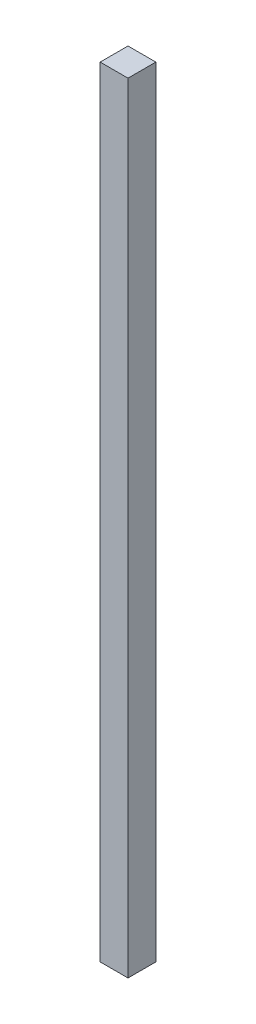
ISO-10303-21;
HEADER;
FILE_DESCRIPTION(('STEP AP214'),'2;1');
FILE_NAME('part.step','',(''),(''),'','','');
FILE_SCHEMA(('AUTOMOTIVE_DESIGN { 1 0 10303 214 1 1 1 1 }'));
ENDSEC;
DATA;
#1=APPLICATION_CONTEXT('core data for automotive mechanical design processes');
#2=APPLICATION_PROTOCOL_DEFINITION('international standard','automotive_design',2000,#1);
#3=PRODUCT_CONTEXT('',#1,'mechanical');
#4=PRODUCT('Part','Part','',(#3));
#5=PRODUCT_RELATED_PRODUCT_CATEGORY('part','',(#4));
#6=PRODUCT_DEFINITION_FORMATION('','',#4);
#7=PRODUCT_DEFINITION_CONTEXT('part definition',#1,'design');
#8=PRODUCT_DEFINITION('design','',#6,#7);
#9=PRODUCT_DEFINITION_SHAPE('','',#8);
#10=(LENGTH_UNIT() NAMED_UNIT(*) SI_UNIT(.MILLI.,.METRE.));
#11=(NAMED_UNIT(*) PLANE_ANGLE_UNIT() SI_UNIT($,.RADIAN.));
#12=(NAMED_UNIT(*) SI_UNIT($,.STERADIAN.) SOLID_ANGLE_UNIT());
#13=UNCERTAINTY_MEASURE_WITH_UNIT(LENGTH_MEASURE(1.E-05),#10,'distance_accuracy_value','');
#14=(GEOMETRIC_REPRESENTATION_CONTEXT(3) GLOBAL_UNCERTAINTY_ASSIGNED_CONTEXT((#13)) GLOBAL_UNIT_ASSIGNED_CONTEXT((#10,
#11,#12)) REPRESENTATION_CONTEXT('',''));
#15=CARTESIAN_POINT('',(0.,0.,0.));
#16=DIRECTION('',(0.,0.,1.));
#17=DIRECTION('',(1.,0.,0.));
#18=AXIS2_PLACEMENT_3D('',#15,#16,#17);
#19=CARTESIAN_POINT('',(0.,700.,0.));
#20=DIRECTION('',(-1.,0.,0.));
#21=DIRECTION('',(0.,0.,1.));
#22=AXIS2_PLACEMENT_3D('',#19,#20,#21);
#23=PLANE('',#22);
#24=DIRECTION('',(0.,0.,-1.));
#25=VECTOR('',#24,1.);
#26=CARTESIAN_POINT('',(0.,0.,0.));
#27=LINE('',#26,#25);
#28=CARTESIAN_POINT('',(0.,0.,25.));
#29=VERTEX_POINT('',#28);
#30=CARTESIAN_POINT('',(0.,0.,0.));
#31=VERTEX_POINT('',#30);
#32=EDGE_CURVE('E96',#29,#31,#27,.T.);
#33=ORIENTED_EDGE('',*,*,#32,.T.);
#34=DIRECTION('',(0.,-1.,0.));
#35=VECTOR('',#34,1.);
#36=CARTESIAN_POINT('',(0.,700.,0.));
#37=LINE('',#36,#35);
#38=CARTESIAN_POINT('',(0.,700.,0.));
#39=VERTEX_POINT('',#38);
#40=EDGE_CURVE('E11',#39,#31,#37,.T.);
#41=ORIENTED_EDGE('',*,*,#40,.F.);
#42=DIRECTION('',(0.,0.,-1.));
#43=VECTOR('',#42,1.);
#44=CARTESIAN_POINT('',(0.,700.,0.));
#45=LINE('',#44,#43);
#46=CARTESIAN_POINT('',(0.,700.,25.));
#47=VERTEX_POINT('',#46);
#48=EDGE_CURVE('E84',#47,#39,#45,.T.);
#49=ORIENTED_EDGE('',*,*,#48,.F.);
#50=DIRECTION('',(0.,-1.,0.));
#51=VECTOR('',#50,1.);
#52=CARTESIAN_POINT('',(0.,700.,25.));
#53=LINE('',#52,#51);
#54=EDGE_CURVE('E92',#47,#29,#53,.T.);
#55=ORIENTED_EDGE('',*,*,#54,.T.);
#56=EDGE_LOOP('',(#33,#41,#49,#55));
#57=FACE_BOUND('',#56,.T.);
#58=ADVANCED_FACE('F33',(#57),#23,.F.);
#59=CARTESIAN_POINT('',(0.,700.,0.));
#60=DIRECTION('',(0.,0.,1.));
#61=DIRECTION('',(1.,0.,0.));
#62=AXIS2_PLACEMENT_3D('',#59,#60,#61);
#63=PLANE('',#62);
#64=DIRECTION('',(-1.,0.,0.));
#65=VECTOR('',#64,1.);
#66=CARTESIAN_POINT('',(0.,0.,0.));
#67=LINE('',#66,#65);
#68=CARTESIAN_POINT('',(-25.,0.,0.));
#69=VERTEX_POINT('',#68);
#70=EDGE_CURVE('E88',#31,#69,#67,.T.);
#71=ORIENTED_EDGE('',*,*,#70,.T.);
#72=DIRECTION('',(0.,-1.,0.));
#73=VECTOR('',#72,1.);
#74=CARTESIAN_POINT('',(-25.,700.,0.));
#75=LINE('',#74,#73);
#76=CARTESIAN_POINT('',(-25.,700.,0.));
#77=VERTEX_POINT('',#76);
#78=EDGE_CURVE('E41',#77,#69,#75,.T.);
#79=ORIENTED_EDGE('',*,*,#78,.F.);
#80=DIRECTION('',(-1.,0.,0.));
#81=VECTOR('',#80,1.);
#82=CARTESIAN_POINT('',(0.,700.,0.));
#83=LINE('',#82,#81);
#84=EDGE_CURVE('E79',#39,#77,#83,.T.);
#85=ORIENTED_EDGE('',*,*,#84,.F.);
#86=ORIENTED_EDGE('',*,*,#40,.T.);
#87=EDGE_LOOP('',(#71,#79,#85,#86));
#88=FACE_BOUND('',#87,.T.);
#89=ADVANCED_FACE('F87',(#88),#63,.F.);
#90=CARTESIAN_POINT('',(-25.,700.,0.));
#91=DIRECTION('',(1.,0.,0.));
#92=DIRECTION('',(0.,0.,-1.));
#93=AXIS2_PLACEMENT_3D('',#90,#91,#92);
#94=PLANE('',#93);
#95=DIRECTION('',(0.,0.,1.));
#96=VECTOR('',#95,1.);
#97=CARTESIAN_POINT('',(-25.,0.,0.));
#98=LINE('',#97,#96);
#99=CARTESIAN_POINT('',(-25.,0.,25.));
#100=VERTEX_POINT('',#99);
#101=EDGE_CURVE('E66',#69,#100,#98,.T.);
#102=ORIENTED_EDGE('',*,*,#101,.T.);
#103=DIRECTION('',(0.,-1.,0.));
#104=VECTOR('',#103,1.);
#105=CARTESIAN_POINT('',(-25.,700.,25.));
#106=LINE('',#105,#104);
#107=CARTESIAN_POINT('',(-25.,700.,25.));
#108=VERTEX_POINT('',#107);
#109=EDGE_CURVE('E89',#108,#100,#106,.T.);
#110=ORIENTED_EDGE('',*,*,#109,.F.);
#111=DIRECTION('',(0.,0.,1.));
#112=VECTOR('',#111,1.);
#113=CARTESIAN_POINT('',(-25.,700.,0.));
#114=LINE('',#113,#112);
#115=EDGE_CURVE('E82',#77,#108,#114,.T.);
#116=ORIENTED_EDGE('',*,*,#115,.F.);
#117=ORIENTED_EDGE('',*,*,#78,.T.);
#118=EDGE_LOOP('',(#102,#110,#116,#117));
#119=FACE_BOUND('',#118,.T.);
#120=ADVANCED_FACE('F90',(#119),#94,.F.);
#121=CARTESIAN_POINT('',(0.,700.,25.));
#122=DIRECTION('',(0.,0.,-1.));
#123=DIRECTION('',(-1.,0.,0.));
#124=AXIS2_PLACEMENT_3D('',#121,#122,#123);
#125=PLANE('',#124);
#126=DIRECTION('',(1.,0.,0.));
#127=VECTOR('',#126,1.);
#128=CARTESIAN_POINT('',(0.,0.,25.));
#129=LINE('',#128,#127);
#130=EDGE_CURVE('E72',#100,#29,#129,.T.);
#131=ORIENTED_EDGE('',*,*,#130,.T.);
#132=ORIENTED_EDGE('',*,*,#54,.F.);
#133=DIRECTION('',(1.,0.,0.));
#134=VECTOR('',#133,1.);
#135=CARTESIAN_POINT('',(0.,700.,25.));
#136=LINE('',#135,#134);
#137=EDGE_CURVE('E49',#108,#47,#136,.T.);
#138=ORIENTED_EDGE('',*,*,#137,.F.);
#139=ORIENTED_EDGE('',*,*,#109,.T.);
#140=EDGE_LOOP('',(#131,#132,#138,#139));
#141=FACE_BOUND('',#140,.T.);
#142=ADVANCED_FACE('F103',(#141),#125,.F.);
#143=CARTESIAN_POINT('',(0.,700.,0.));
#144=DIRECTION('',(0.,-1.,0.));
#145=DIRECTION('',(0.,0.,-1.));
#146=AXIS2_PLACEMENT_3D('',#143,#144,#145);
#147=PLANE('',#146);
#148=ORIENTED_EDGE('',*,*,#48,.T.);
#149=ORIENTED_EDGE('',*,*,#84,.T.);
#150=ORIENTED_EDGE('',*,*,#115,.T.);
#151=ORIENTED_EDGE('',*,*,#137,.T.);
#152=EDGE_LOOP('',(#148,#149,#150,#151));
#153=FACE_BOUND('',#152,.T.);
#154=ADVANCED_FACE('F80',(#153),#147,.F.);
#155=CARTESIAN_POINT('',(0.,0.,0.));
#156=DIRECTION('',(0.,-1.,0.));
#157=DIRECTION('',(0.,0.,-1.));
#158=AXIS2_PLACEMENT_3D('',#155,#156,#157);
#159=PLANE('',#158);
#160=ORIENTED_EDGE('',*,*,#32,.F.);
#161=ORIENTED_EDGE('',*,*,#130,.F.);
#162=ORIENTED_EDGE('',*,*,#101,.F.);
#163=ORIENTED_EDGE('',*,*,#70,.F.);
#164=EDGE_LOOP('',(#160,#161,#162,#163));
#165=FACE_BOUND('',#164,.T.);
#166=ADVANCED_FACE('F106',(#165),#159,.T.);
#167=CLOSED_SHELL('',(#58,#89,#120,#142,#154,#166));
#168=MANIFOLD_SOLID_BREP('B2',#167);
#169=ADVANCED_BREP_SHAPE_REPRESENTATION('',(#18,#168),#14);
#170=SHAPE_DEFINITION_REPRESENTATION(#9,#169);
ENDSEC;
END-ISO-10303-21;
